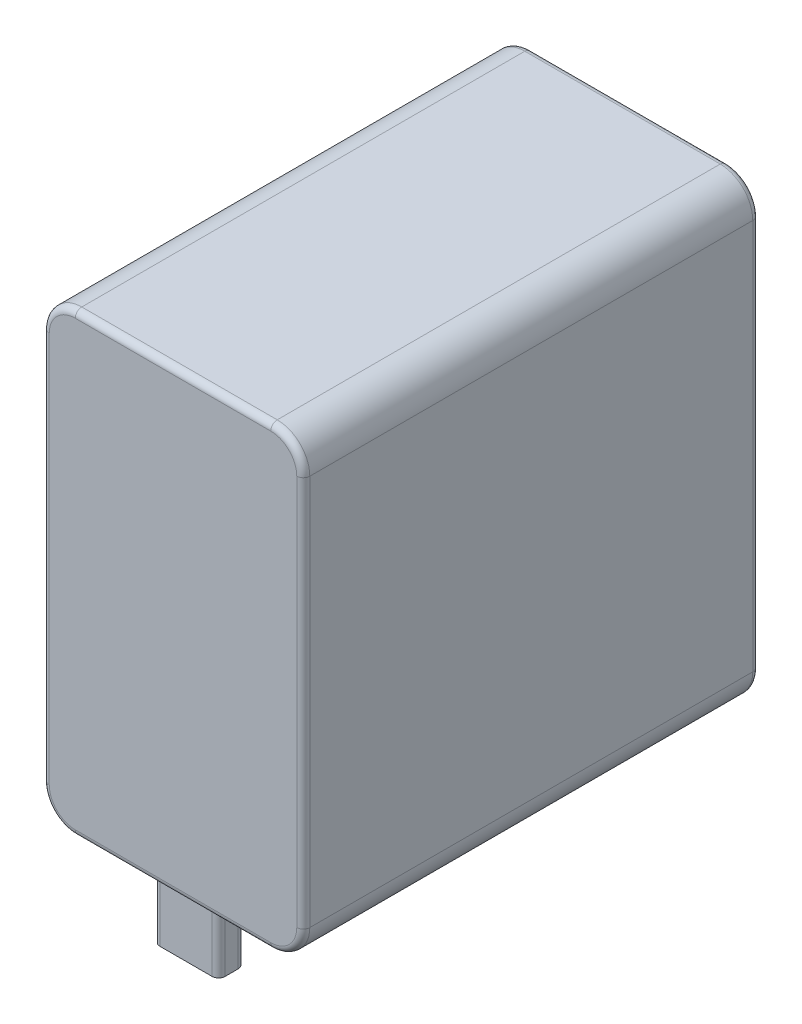
ISO-10303-21;
HEADER;
FILE_DESCRIPTION(('STEP AP214'),'2;1');
FILE_NAME('part.step','',(''),(''),'','','');
FILE_SCHEMA(('AUTOMOTIVE_DESIGN { 1 0 10303 214 1 1 1 1 }'));
ENDSEC;
DATA;
#1=APPLICATION_CONTEXT('core data for automotive mechanical design processes');
#2=APPLICATION_PROTOCOL_DEFINITION('international standard','automotive_design',2000,#1);
#3=PRODUCT_CONTEXT('',#1,'mechanical');
#4=PRODUCT('Part','Part','',(#3));
#5=PRODUCT_RELATED_PRODUCT_CATEGORY('part','',(#4));
#6=PRODUCT_DEFINITION_FORMATION('','',#4);
#7=PRODUCT_DEFINITION_CONTEXT('part definition',#1,'design');
#8=PRODUCT_DEFINITION('design','',#6,#7);
#9=PRODUCT_DEFINITION_SHAPE('','',#8);
#10=(LENGTH_UNIT() NAMED_UNIT(*) SI_UNIT(.MILLI.,.METRE.));
#11=(NAMED_UNIT(*) PLANE_ANGLE_UNIT() SI_UNIT($,.RADIAN.));
#12=(NAMED_UNIT(*) SI_UNIT($,.STERADIAN.) SOLID_ANGLE_UNIT());
#13=UNCERTAINTY_MEASURE_WITH_UNIT(LENGTH_MEASURE(1.E-05),#10,'distance_accuracy_value','');
#14=(GEOMETRIC_REPRESENTATION_CONTEXT(3) GLOBAL_UNCERTAINTY_ASSIGNED_CONTEXT((#13)) GLOBAL_UNIT_ASSIGNED_CONTEXT((#10,
#11,#12)) REPRESENTATION_CONTEXT('',''));
#15=CARTESIAN_POINT('',(0.,0.,0.));
#16=DIRECTION('',(0.,0.,1.));
#17=DIRECTION('',(1.,0.,0.));
#18=AXIS2_PLACEMENT_3D('',#15,#16,#17);
#19=CARTESIAN_POINT('',(24.,-38.,-3.));
#20=DIRECTION('',(0.,1.,0.));
#21=DIRECTION('',(0.,0.,1.));
#22=AXIS2_PLACEMENT_3D('',#19,#20,#21);
#23=CYLINDRICAL_SURFACE('',#22,1.);
#24=CARTESIAN_POINT('',(24.,-38.,-3.));
#25=DIRECTION('',(0.,-1.,0.));
#26=DIRECTION('',(0.,0.,-1.));
#27=AXIS2_PLACEMENT_3D('',#24,#25,#26);
#28=CIRCLE('',#27,1.);
#29=CARTESIAN_POINT('',(25.,-38.,-3.));
#30=VERTEX_POINT('',#29);
#31=CARTESIAN_POINT('',(24.,-38.,-2.));
#32=VERTEX_POINT('',#31);
#33=EDGE_CURVE('E319',#30,#32,#28,.T.);
#34=ORIENTED_EDGE('',*,*,#33,.F.);
#35=DIRECTION('',(0.,-1.,0.));
#36=VECTOR('',#35,1.);
#37=CARTESIAN_POINT('',(25.,-38.,-3.));
#38=LINE('',#37,#36);
#39=CARTESIAN_POINT('',(25.,-28.,-3.));
#40=VERTEX_POINT('',#39);
#41=EDGE_CURVE('E433',#40,#30,#38,.T.);
#42=ORIENTED_EDGE('',*,*,#41,.F.);
#43=CARTESIAN_POINT('',(24.,-28.,-3.));
#44=DIRECTION('',(0.,1.,0.));
#45=DIRECTION('',(0.,0.,1.));
#46=AXIS2_PLACEMENT_3D('',#43,#44,#45);
#47=CIRCLE('',#46,1.);
#48=CARTESIAN_POINT('',(24.,-28.,-2.));
#49=VERTEX_POINT('',#48);
#50=EDGE_CURVE('E311',#49,#40,#47,.T.);
#51=ORIENTED_EDGE('',*,*,#50,.F.);
#52=DIRECTION('',(0.,1.,0.));
#53=VECTOR('',#52,1.);
#54=CARTESIAN_POINT('',(24.,-38.,-2.));
#55=LINE('',#54,#53);
#56=EDGE_CURVE('E421',#32,#49,#55,.T.);
#57=ORIENTED_EDGE('',*,*,#56,.F.);
#58=EDGE_LOOP('',(#34,#42,#51,#57));
#59=FACE_BOUND('',#58,.T.);
#60=ADVANCED_FACE('F61',(#59),#23,.T.);
#61=CARTESIAN_POINT('',(16.,-38.,-3.));
#62=DIRECTION('',(0.,-1.,0.));
#63=DIRECTION('',(0.,0.,-1.));
#64=AXIS2_PLACEMENT_3D('',#61,#62,#63);
#65=CYLINDRICAL_SURFACE('',#64,1.);
#66=CARTESIAN_POINT('',(16.,-38.,-3.));
#67=DIRECTION('',(0.,-1.,0.));
#68=DIRECTION('',(0.,0.,-1.));
#69=AXIS2_PLACEMENT_3D('',#66,#67,#68);
#70=CIRCLE('',#69,1.);
#71=CARTESIAN_POINT('',(16.,-38.,-2.));
#72=VERTEX_POINT('',#71);
#73=CARTESIAN_POINT('',(15.,-38.,-3.));
#74=VERTEX_POINT('',#73);
#75=EDGE_CURVE('E402',#72,#74,#70,.T.);
#76=ORIENTED_EDGE('',*,*,#75,.F.);
#77=DIRECTION('',(0.,-1.,0.));
#78=VECTOR('',#77,1.);
#79=CARTESIAN_POINT('',(16.,-38.,-2.));
#80=LINE('',#79,#78);
#81=CARTESIAN_POINT('',(16.,-28.,-2.));
#82=VERTEX_POINT('',#81);
#83=EDGE_CURVE('E348',#82,#72,#80,.T.);
#84=ORIENTED_EDGE('',*,*,#83,.F.);
#85=CARTESIAN_POINT('',(16.,-28.,-3.));
#86=DIRECTION('',(0.,1.,0.));
#87=DIRECTION('',(0.,0.,1.));
#88=AXIS2_PLACEMENT_3D('',#85,#86,#87);
#89=CIRCLE('',#88,1.);
#90=CARTESIAN_POINT('',(15.,-28.,-3.));
#91=VERTEX_POINT('',#90);
#92=EDGE_CURVE('E312',#91,#82,#89,.T.);
#93=ORIENTED_EDGE('',*,*,#92,.F.);
#94=DIRECTION('',(0.,1.,0.));
#95=VECTOR('',#94,1.);
#96=CARTESIAN_POINT('',(15.,-28.,-3.));
#97=LINE('',#96,#95);
#98=EDGE_CURVE('E366',#74,#91,#97,.T.);
#99=ORIENTED_EDGE('',*,*,#98,.F.);
#100=EDGE_LOOP('',(#76,#84,#93,#99));
#101=FACE_BOUND('',#100,.T.);
#102=ADVANCED_FACE('F589',(#101),#65,.T.);
#103=CARTESIAN_POINT('',(24.,-38.,-5.));
#104=DIRECTION('',(0.,-1.,0.));
#105=DIRECTION('',(0.,0.,-1.));
#106=AXIS2_PLACEMENT_3D('',#103,#104,#105);
#107=CYLINDRICAL_SURFACE('',#106,1.);
#108=CARTESIAN_POINT('',(24.,-38.,-5.));
#109=DIRECTION('',(0.,-1.,0.));
#110=DIRECTION('',(0.,0.,-1.));
#111=AXIS2_PLACEMENT_3D('',#108,#109,#110);
#112=CIRCLE('',#111,1.);
#113=CARTESIAN_POINT('',(24.,-38.,-6.));
#114=VERTEX_POINT('',#113);
#115=CARTESIAN_POINT('',(25.,-38.,-5.));
#116=VERTEX_POINT('',#115);
#117=EDGE_CURVE('E316',#114,#116,#112,.T.);
#118=ORIENTED_EDGE('',*,*,#117,.F.);
#119=DIRECTION('',(0.,-1.,0.));
#120=VECTOR('',#119,1.);
#121=CARTESIAN_POINT('',(24.,-38.,-6.));
#122=LINE('',#121,#120);
#123=CARTESIAN_POINT('',(24.,-28.,-6.));
#124=VERTEX_POINT('',#123);
#125=EDGE_CURVE('E388',#124,#114,#122,.T.);
#126=ORIENTED_EDGE('',*,*,#125,.F.);
#127=CARTESIAN_POINT('',(24.,-28.,-5.));
#128=DIRECTION('',(0.,1.,0.));
#129=DIRECTION('',(0.,0.,1.));
#130=AXIS2_PLACEMENT_3D('',#127,#128,#129);
#131=CIRCLE('',#130,1.);
#132=CARTESIAN_POINT('',(25.,-28.,-5.));
#133=VERTEX_POINT('',#132);
#134=EDGE_CURVE('E331',#133,#124,#131,.T.);
#135=ORIENTED_EDGE('',*,*,#134,.F.);
#136=DIRECTION('',(0.,1.,0.));
#137=VECTOR('',#136,1.);
#138=CARTESIAN_POINT('',(25.,-28.,-5.));
#139=LINE('',#138,#137);
#140=EDGE_CURVE('E387',#116,#133,#139,.T.);
#141=ORIENTED_EDGE('',*,*,#140,.F.);
#142=EDGE_LOOP('',(#118,#126,#135,#141));
#143=FACE_BOUND('',#142,.T.);
#144=ADVANCED_FACE('F575',(#143),#107,.T.);
#145=CARTESIAN_POINT('',(16.,-38.,-5.));
#146=DIRECTION('',(0.,1.,0.));
#147=DIRECTION('',(0.,0.,1.));
#148=AXIS2_PLACEMENT_3D('',#145,#146,#147);
#149=CYLINDRICAL_SURFACE('',#148,1.);
#150=CARTESIAN_POINT('',(16.,-38.,-5.));
#151=DIRECTION('',(0.,-1.,0.));
#152=DIRECTION('',(0.,0.,-1.));
#153=AXIS2_PLACEMENT_3D('',#150,#151,#152);
#154=CIRCLE('',#153,1.);
#155=CARTESIAN_POINT('',(15.,-38.,-5.));
#156=VERTEX_POINT('',#155);
#157=CARTESIAN_POINT('',(16.,-38.,-6.));
#158=VERTEX_POINT('',#157);
#159=EDGE_CURVE('E320',#156,#158,#154,.T.);
#160=ORIENTED_EDGE('',*,*,#159,.F.);
#161=DIRECTION('',(0.,-1.,0.));
#162=VECTOR('',#161,1.);
#163=CARTESIAN_POINT('',(15.,-38.,-5.));
#164=LINE('',#163,#162);
#165=CARTESIAN_POINT('',(15.,-28.,-5.));
#166=VERTEX_POINT('',#165);
#167=EDGE_CURVE('E367',#166,#156,#164,.T.);
#168=ORIENTED_EDGE('',*,*,#167,.F.);
#169=CARTESIAN_POINT('',(16.,-28.,-5.));
#170=DIRECTION('',(0.,1.,0.));
#171=DIRECTION('',(0.,0.,1.));
#172=AXIS2_PLACEMENT_3D('',#169,#170,#171);
#173=CIRCLE('',#172,1.);
#174=CARTESIAN_POINT('',(16.,-28.,-6.));
#175=VERTEX_POINT('',#174);
#176=EDGE_CURVE('E371',#175,#166,#173,.T.);
#177=ORIENTED_EDGE('',*,*,#176,.F.);
#178=DIRECTION('',(0.,1.,0.));
#179=VECTOR('',#178,1.);
#180=CARTESIAN_POINT('',(16.,-38.,-6.));
#181=LINE('',#180,#179);
#182=EDGE_CURVE('E428',#158,#175,#181,.T.);
#183=ORIENTED_EDGE('',*,*,#182,.F.);
#184=EDGE_LOOP('',(#160,#168,#177,#183));
#185=FACE_BOUND('',#184,.T.);
#186=ADVANCED_FACE('F878',(#185),#149,.T.);
#187=CARTESIAN_POINT('',(1.,0.,-1.));
#188=DIRECTION('',(0.,-1.,0.));
#189=DIRECTION('',(0.,0.,-1.));
#190=AXIS2_PLACEMENT_3D('',#187,#188,#189);
#191=CYLINDRICAL_SURFACE('',#190,1.);
#192=DIRECTION('',(0.,-1.,0.));
#193=VECTOR('',#192,1.);
#194=CARTESIAN_POINT('',(1.,-23.,0.));
#195=LINE('',#194,#193);
#196=CARTESIAN_POINT('',(1.,37.,0.));
#197=VERTEX_POINT('',#196);
#198=CARTESIAN_POINT('',(1.,-23.,0.));
#199=VERTEX_POINT('',#198);
#200=EDGE_CURVE('E521',#197,#199,#195,.T.);
#201=ORIENTED_EDGE('',*,*,#200,.F.);
#202=CARTESIAN_POINT('',(1.,37.,-1.));
#203=DIRECTION('',(0.,-1.,0.));
#204=DIRECTION('',(0.,0.,-1.));
#205=AXIS2_PLACEMENT_3D('',#202,#203,#204);
#206=CIRCLE('',#205,1.);
#207=CARTESIAN_POINT('',(0.,37.,-1.));
#208=VERTEX_POINT('',#207);
#209=EDGE_CURVE('E502',#197,#208,#206,.T.);
#210=ORIENTED_EDGE('',*,*,#209,.T.);
#211=DIRECTION('',(0.,1.,0.));
#212=VECTOR('',#211,1.);
#213=CARTESIAN_POINT('',(0.,23.,-1.));
#214=LINE('',#213,#212);
#215=CARTESIAN_POINT('',(0.,-23.,-1.));
#216=VERTEX_POINT('',#215);
#217=EDGE_CURVE('E344',#216,#208,#214,.T.);
#218=ORIENTED_EDGE('',*,*,#217,.F.);
#219=CARTESIAN_POINT('',(1.,-23.,-1.));
#220=DIRECTION('',(0.,1.,0.));
#221=DIRECTION('',(0.,0.,1.));
#222=AXIS2_PLACEMENT_3D('',#219,#220,#221);
#223=CIRCLE('',#222,1.);
#224=EDGE_CURVE('E268',#216,#199,#223,.T.);
#225=ORIENTED_EDGE('',*,*,#224,.T.);
#226=EDGE_LOOP('',(#201,#210,#218,#225));
#227=FACE_BOUND('',#226,.T.);
#228=ADVANCED_FACE('F540',(#227),#191,.T.);
#229=CARTESIAN_POINT('',(5.,-23.,-1.));
#230=DIRECTION('',(0.,0.,1.));
#231=DIRECTION('',(1.,0.,0.));
#232=AXIS2_PLACEMENT_3D('',#229,#230,#231);
#233=TOROIDAL_SURFACE('',#232,4.,1.);
#234=CARTESIAN_POINT('',(5.,-27.,-1.));
#235=DIRECTION('',(-1.,0.,0.));
#236=DIRECTION('',(0.,0.,1.));
#237=AXIS2_PLACEMENT_3D('',#234,#235,#236);
#238=CIRCLE('',#237,1.);
#239=CARTESIAN_POINT('',(5.,-28.,-1.));
#240=VERTEX_POINT('',#239);
#241=CARTESIAN_POINT('',(5.,-27.,0.));
#242=VERTEX_POINT('',#241);
#243=EDGE_CURVE('E256',#240,#242,#238,.T.);
#244=ORIENTED_EDGE('',*,*,#243,.T.);
#245=CARTESIAN_POINT('',(5.,-23.,0.));
#246=DIRECTION('',(0.,0.,1.));
#247=DIRECTION('',(1.,0.,0.));
#248=AXIS2_PLACEMENT_3D('',#245,#246,#247);
#249=CIRCLE('',#248,4.);
#250=EDGE_CURVE('E542',#199,#242,#249,.T.);
#251=ORIENTED_EDGE('',*,*,#250,.F.);
#252=ORIENTED_EDGE('',*,*,#224,.F.);
#253=CARTESIAN_POINT('',(5.,-23.,-1.));
#254=DIRECTION('',(0.,0.,-1.));
#255=DIRECTION('',(1.,0.,0.));
#256=AXIS2_PLACEMENT_3D('',#253,#254,#255);
#257=CIRCLE('',#256,5.);
#258=EDGE_CURVE('E272',#240,#216,#257,.T.);
#259=ORIENTED_EDGE('',*,*,#258,.F.);
#260=EDGE_LOOP('',(#244,#251,#252,#259));
#261=FACE_BOUND('',#260,.T.);
#262=ADVANCED_FACE('F273',(#261),#233,.T.);
#263=CARTESIAN_POINT('',(40.,-27.,-1.));
#264=DIRECTION('',(1.,0.,0.));
#265=DIRECTION('',(0.,0.,-1.));
#266=AXIS2_PLACEMENT_3D('',#263,#264,#265);
#267=CYLINDRICAL_SURFACE('',#266,1.);
#268=CARTESIAN_POINT('',(35.,-27.,-1.));
#269=DIRECTION('',(-1.,0.,0.));
#270=DIRECTION('',(0.,0.,1.));
#271=AXIS2_PLACEMENT_3D('',#268,#269,#270);
#272=CIRCLE('',#271,1.);
#273=CARTESIAN_POINT('',(35.,-28.,-1.));
#274=VERTEX_POINT('',#273);
#275=CARTESIAN_POINT('',(35.,-27.,0.));
#276=VERTEX_POINT('',#275);
#277=EDGE_CURVE('E269',#274,#276,#272,.T.);
#278=ORIENTED_EDGE('',*,*,#277,.T.);
#279=DIRECTION('',(1.,0.,0.));
#280=VECTOR('',#279,1.);
#281=CARTESIAN_POINT('',(35.,-27.,0.));
#282=LINE('',#281,#280);
#283=EDGE_CURVE('E263',#242,#276,#282,.T.);
#284=ORIENTED_EDGE('',*,*,#283,.F.);
#285=ORIENTED_EDGE('',*,*,#243,.F.);
#286=DIRECTION('',(-1.,0.,0.));
#287=VECTOR('',#286,1.);
#288=CARTESIAN_POINT('',(5.,-28.,-1.));
#289=LINE('',#288,#287);
#290=EDGE_CURVE('E260',#274,#240,#289,.T.);
#291=ORIENTED_EDGE('',*,*,#290,.F.);
#292=EDGE_LOOP('',(#278,#284,#285,#291));
#293=FACE_BOUND('',#292,.T.);
#294=ADVANCED_FACE('F258',(#293),#267,.T.);
#295=CARTESIAN_POINT('',(35.,-23.,-1.));
#296=DIRECTION('',(0.,0.,1.));
#297=DIRECTION('',(1.,0.,0.));
#298=AXIS2_PLACEMENT_3D('',#295,#296,#297);
#299=TOROIDAL_SURFACE('',#298,4.,1.);
#300=CARTESIAN_POINT('',(39.,-23.,-1.));
#301=DIRECTION('',(0.,-1.,0.));
#302=DIRECTION('',(0.,0.,-1.));
#303=AXIS2_PLACEMENT_3D('',#300,#301,#302);
#304=CIRCLE('',#303,1.);
#305=CARTESIAN_POINT('',(40.,-23.,-1.));
#306=VERTEX_POINT('',#305);
#307=CARTESIAN_POINT('',(39.,-23.,0.));
#308=VERTEX_POINT('',#307);
#309=EDGE_CURVE('E436',#306,#308,#304,.T.);
#310=ORIENTED_EDGE('',*,*,#309,.T.);
#311=CARTESIAN_POINT('',(35.,-23.,0.));
#312=DIRECTION('',(0.,0.,1.));
#313=DIRECTION('',(1.,0.,0.));
#314=AXIS2_PLACEMENT_3D('',#311,#312,#313);
#315=CIRCLE('',#314,4.);
#316=EDGE_CURVE('E305',#276,#308,#315,.T.);
#317=ORIENTED_EDGE('',*,*,#316,.F.);
#318=ORIENTED_EDGE('',*,*,#277,.F.);
#319=CARTESIAN_POINT('',(35.,-23.,-1.));
#320=DIRECTION('',(0.,0.,-1.));
#321=DIRECTION('',(1.,0.,0.));
#322=AXIS2_PLACEMENT_3D('',#319,#320,#321);
#323=CIRCLE('',#322,5.);
#324=EDGE_CURVE('E401',#306,#274,#323,.T.);
#325=ORIENTED_EDGE('',*,*,#324,.F.);
#326=EDGE_LOOP('',(#310,#317,#318,#325));
#327=FACE_BOUND('',#326,.T.);
#328=ADVANCED_FACE('F846',(#327),#299,.T.);
#329=CARTESIAN_POINT('',(39.,0.,-1.));
#330=DIRECTION('',(0.,1.,0.));
#331=DIRECTION('',(0.,0.,1.));
#332=AXIS2_PLACEMENT_3D('',#329,#330,#331);
#333=CYLINDRICAL_SURFACE('',#332,1.);
#334=DIRECTION('',(0.,-1.,0.));
#335=VECTOR('',#334,1.);
#336=CARTESIAN_POINT('',(40.,0.,-1.));
#337=LINE('',#336,#335);
#338=CARTESIAN_POINT('',(40.,37.,-1.));
#339=VERTEX_POINT('',#338);
#340=EDGE_CURVE('E339',#339,#306,#337,.T.);
#341=ORIENTED_EDGE('',*,*,#340,.F.);
#342=CARTESIAN_POINT('',(39.,37.,-1.));
#343=DIRECTION('',(0.,1.,0.));
#344=DIRECTION('',(0.,0.,1.));
#345=AXIS2_PLACEMENT_3D('',#342,#343,#344);
#346=CIRCLE('',#345,1.);
#347=CARTESIAN_POINT('',(39.,37.,0.));
#348=VERTEX_POINT('',#347);
#349=EDGE_CURVE('E498',#339,#348,#346,.F.);
#350=ORIENTED_EDGE('',*,*,#349,.T.);
#351=DIRECTION('',(0.,1.,0.));
#352=VECTOR('',#351,1.);
#353=CARTESIAN_POINT('',(39.,0.,0.));
#354=LINE('',#353,#352);
#355=EDGE_CURVE('E299',#308,#348,#354,.T.);
#356=ORIENTED_EDGE('',*,*,#355,.F.);
#357=ORIENTED_EDGE('',*,*,#309,.F.);
#358=EDGE_LOOP('',(#341,#350,#356,#357));
#359=FACE_BOUND('',#358,.T.);
#360=ADVANCED_FACE('F837',(#359),#333,.T.);
#361=CARTESIAN_POINT('',(40.,-27.,-69.));
#362=DIRECTION('',(-1.,0.,0.));
#363=DIRECTION('',(0.,0.,1.));
#364=AXIS2_PLACEMENT_3D('',#361,#362,#363);
#365=CYLINDRICAL_SURFACE('',#364,1.);
#366=CARTESIAN_POINT('',(35.,-27.,-69.));
#367=DIRECTION('',(-1.,0.,0.));
#368=DIRECTION('',(0.,0.,1.));
#369=AXIS2_PLACEMENT_3D('',#366,#367,#368);
#370=CIRCLE('',#369,1.);
#371=CARTESIAN_POINT('',(35.,-27.,-70.));
#372=VERTEX_POINT('',#371);
#373=CARTESIAN_POINT('',(35.,-28.,-69.));
#374=VERTEX_POINT('',#373);
#375=EDGE_CURVE('E357',#372,#374,#370,.T.);
#376=ORIENTED_EDGE('',*,*,#375,.T.);
#377=DIRECTION('',(1.,0.,0.));
#378=VECTOR('',#377,1.);
#379=CARTESIAN_POINT('',(40.,-28.,-69.));
#380=LINE('',#379,#378);
#381=CARTESIAN_POINT('',(5.,-28.,-69.));
#382=VERTEX_POINT('',#381);
#383=EDGE_CURVE('E298',#382,#374,#380,.T.);
#384=ORIENTED_EDGE('',*,*,#383,.F.);
#385=CARTESIAN_POINT('',(5.,-27.,-69.));
#386=DIRECTION('',(1.,0.,0.));
#387=DIRECTION('',(0.,0.,-1.));
#388=AXIS2_PLACEMENT_3D('',#385,#386,#387);
#389=CIRCLE('',#388,1.);
#390=CARTESIAN_POINT('',(5.,-27.,-70.));
#391=VERTEX_POINT('',#390);
#392=EDGE_CURVE('E360',#382,#391,#389,.T.);
#393=ORIENTED_EDGE('',*,*,#392,.T.);
#394=DIRECTION('',(-1.,0.,0.));
#395=VECTOR('',#394,1.);
#396=CARTESIAN_POINT('',(40.,-27.,-70.));
#397=LINE('',#396,#395);
#398=EDGE_CURVE('E379',#372,#391,#397,.T.);
#399=ORIENTED_EDGE('',*,*,#398,.F.);
#400=EDGE_LOOP('',(#376,#384,#393,#399));
#401=FACE_BOUND('',#400,.T.);
#402=ADVANCED_FACE('F828',(#401),#365,.T.);
#403=CARTESIAN_POINT('',(5.,-23.,-69.));
#404=DIRECTION('',(0.,0.,1.));
#405=DIRECTION('',(1.,0.,0.));
#406=AXIS2_PLACEMENT_3D('',#403,#404,#405);
#407=TOROIDAL_SURFACE('',#406,4.,1.);
#408=CARTESIAN_POINT('',(1.,-23.,-69.));
#409=DIRECTION('',(0.,-1.,0.));
#410=DIRECTION('',(0.,0.,-1.));
#411=AXIS2_PLACEMENT_3D('',#408,#409,#410);
#412=CIRCLE('',#411,1.);
#413=CARTESIAN_POINT('',(0.,-23.,-69.));
#414=VERTEX_POINT('',#413);
#415=CARTESIAN_POINT('',(1.,-23.,-70.));
#416=VERTEX_POINT('',#415);
#417=EDGE_CURVE('E361',#414,#416,#412,.T.);
#418=ORIENTED_EDGE('',*,*,#417,.T.);
#419=CARTESIAN_POINT('',(5.,-23.,-70.));
#420=DIRECTION('',(0.,0.,-1.));
#421=DIRECTION('',(1.,0.,0.));
#422=AXIS2_PLACEMENT_3D('',#419,#420,#421);
#423=CIRCLE('',#422,4.);
#424=EDGE_CURVE('E326',#391,#416,#423,.T.);
#425=ORIENTED_EDGE('',*,*,#424,.F.);
#426=ORIENTED_EDGE('',*,*,#392,.F.);
#427=CARTESIAN_POINT('',(5.,-23.,-69.));
#428=DIRECTION('',(0.,0.,1.));
#429=DIRECTION('',(1.,0.,0.));
#430=AXIS2_PLACEMENT_3D('',#427,#428,#429);
#431=CIRCLE('',#430,5.);
#432=EDGE_CURVE('E281',#414,#382,#431,.T.);
#433=ORIENTED_EDGE('',*,*,#432,.F.);
#434=EDGE_LOOP('',(#418,#425,#426,#433));
#435=FACE_BOUND('',#434,.T.);
#436=ADVANCED_FACE('F819',(#435),#407,.T.);
#437=CARTESIAN_POINT('',(35.,-23.,-69.));
#438=DIRECTION('',(0.,0.,1.));
#439=DIRECTION('',(1.,0.,0.));
#440=AXIS2_PLACEMENT_3D('',#437,#438,#439);
#441=TOROIDAL_SURFACE('',#440,4.,1.);
#442=CARTESIAN_POINT('',(39.,-23.,-69.));
#443=DIRECTION('',(0.,-1.,0.));
#444=DIRECTION('',(0.,0.,-1.));
#445=AXIS2_PLACEMENT_3D('',#442,#443,#444);
#446=CIRCLE('',#445,1.);
#447=CARTESIAN_POINT('',(39.,-23.,-70.));
#448=VERTEX_POINT('',#447);
#449=CARTESIAN_POINT('',(40.,-23.,-69.));
#450=VERTEX_POINT('',#449);
#451=EDGE_CURVE('E280',#448,#450,#446,.T.);
#452=ORIENTED_EDGE('',*,*,#451,.T.);
#453=CARTESIAN_POINT('',(35.,-23.,-69.));
#454=DIRECTION('',(0.,0.,1.));
#455=DIRECTION('',(1.,0.,0.));
#456=AXIS2_PLACEMENT_3D('',#453,#454,#455);
#457=CIRCLE('',#456,5.);
#458=EDGE_CURVE('E397',#374,#450,#457,.T.);
#459=ORIENTED_EDGE('',*,*,#458,.F.);
#460=ORIENTED_EDGE('',*,*,#375,.F.);
#461=CARTESIAN_POINT('',(35.,-23.,-70.));
#462=DIRECTION('',(0.,0.,-1.));
#463=DIRECTION('',(1.,0.,0.));
#464=AXIS2_PLACEMENT_3D('',#461,#462,#463);
#465=CIRCLE('',#464,4.);
#466=EDGE_CURVE('E375',#448,#372,#465,.T.);
#467=ORIENTED_EDGE('',*,*,#466,.F.);
#468=EDGE_LOOP('',(#452,#459,#460,#467));
#469=FACE_BOUND('',#468,.T.);
#470=ADVANCED_FACE('F809',(#469),#441,.T.);
#471=CARTESIAN_POINT('',(1.,0.,-69.));
#472=DIRECTION('',(0.,1.,0.));
#473=DIRECTION('',(0.,0.,1.));
#474=AXIS2_PLACEMENT_3D('',#471,#472,#473);
#475=CYLINDRICAL_SURFACE('',#474,1.);
#476=DIRECTION('',(0.,-1.,0.));
#477=VECTOR('',#476,1.);
#478=CARTESIAN_POINT('',(0.,0.,-69.));
#479=LINE('',#478,#477);
#480=CARTESIAN_POINT('',(0.,37.,-69.));
#481=VERTEX_POINT('',#480);
#482=EDGE_CURVE('E405',#481,#414,#479,.T.);
#483=ORIENTED_EDGE('',*,*,#482,.F.);
#484=CARTESIAN_POINT('',(1.,37.,-69.));
#485=DIRECTION('',(0.,1.,0.));
#486=DIRECTION('',(0.,0.,1.));
#487=AXIS2_PLACEMENT_3D('',#484,#485,#486);
#488=CIRCLE('',#487,1.);
#489=CARTESIAN_POINT('',(1.,37.,-70.));
#490=VERTEX_POINT('',#489);
#491=EDGE_CURVE('E489',#481,#490,#488,.F.);
#492=ORIENTED_EDGE('',*,*,#491,.T.);
#493=DIRECTION('',(0.,1.,0.));
#494=VECTOR('',#493,1.);
#495=CARTESIAN_POINT('',(1.,0.,-70.));
#496=LINE('',#495,#494);
#497=EDGE_CURVE('E321',#416,#490,#496,.T.);
#498=ORIENTED_EDGE('',*,*,#497,.F.);
#499=ORIENTED_EDGE('',*,*,#417,.F.);
#500=EDGE_LOOP('',(#483,#492,#498,#499));
#501=FACE_BOUND('',#500,.T.);
#502=ADVANCED_FACE('F799',(#501),#475,.T.);
#503=CARTESIAN_POINT('',(39.,0.,-69.));
#504=DIRECTION('',(0.,-1.,0.));
#505=DIRECTION('',(0.,0.,-1.));
#506=AXIS2_PLACEMENT_3D('',#503,#504,#505);
#507=CYLINDRICAL_SURFACE('',#506,1.);
#508=DIRECTION('',(0.,-1.,0.));
#509=VECTOR('',#508,1.);
#510=CARTESIAN_POINT('',(39.,-23.,-70.));
#511=LINE('',#510,#509);
#512=CARTESIAN_POINT('',(39.,37.,-70.));
#513=VERTEX_POINT('',#512);
#514=EDGE_CURVE('E325',#513,#448,#511,.T.);
#515=ORIENTED_EDGE('',*,*,#514,.F.);
#516=CARTESIAN_POINT('',(39.,37.,-69.));
#517=DIRECTION('',(0.,-1.,0.));
#518=DIRECTION('',(0.,0.,-1.));
#519=AXIS2_PLACEMENT_3D('',#516,#517,#518);
#520=CIRCLE('',#519,1.);
#521=CARTESIAN_POINT('',(40.,37.,-69.));
#522=VERTEX_POINT('',#521);
#523=EDGE_CURVE('E470',#513,#522,#520,.T.);
#524=ORIENTED_EDGE('',*,*,#523,.T.);
#525=DIRECTION('',(0.,1.,0.));
#526=VECTOR('',#525,1.);
#527=CARTESIAN_POINT('',(40.,23.,-69.));
#528=LINE('',#527,#526);
#529=EDGE_CURVE('E335',#450,#522,#528,.T.);
#530=ORIENTED_EDGE('',*,*,#529,.F.);
#531=ORIENTED_EDGE('',*,*,#451,.F.);
#532=EDGE_LOOP('',(#515,#524,#530,#531));
#533=FACE_BOUND('',#532,.T.);
#534=ADVANCED_FACE('F791',(#533),#507,.T.);
#535=CARTESIAN_POINT('',(5.,-23.,-35.));
#536=DIRECTION('',(0.,0.,-1.));
#537=DIRECTION('',(0.,1.,0.));
#538=AXIS2_PLACEMENT_3D('',#535,#536,#537);
#539=CYLINDRICAL_SURFACE('',#538,5.);
#540=DIRECTION('',(0.,0.,1.));
#541=VECTOR('',#540,1.);
#542=CARTESIAN_POINT('',(0.,-23.,-35.));
#543=LINE('',#542,#541);
#544=EDGE_CURVE('E349',#414,#216,#543,.T.);
#545=ORIENTED_EDGE('',*,*,#544,.F.);
#546=ORIENTED_EDGE('',*,*,#432,.T.);
#547=DIRECTION('',(0.,0.,-1.));
#548=VECTOR('',#547,1.);
#549=CARTESIAN_POINT('',(5.,-28.,-35.));
#550=LINE('',#549,#548);
#551=EDGE_CURVE('E287',#240,#382,#550,.T.);
#552=ORIENTED_EDGE('',*,*,#551,.F.);
#553=ORIENTED_EDGE('',*,*,#258,.T.);
#554=EDGE_LOOP('',(#545,#546,#552,#553));
#555=FACE_BOUND('',#554,.T.);
#556=ADVANCED_FACE('F294',(#555),#539,.T.);
#557=CARTESIAN_POINT('',(35.,-23.,-35.));
#558=DIRECTION('',(0.,0.,1.));
#559=DIRECTION('',(0.,-1.,0.));
#560=AXIS2_PLACEMENT_3D('',#557,#558,#559);
#561=CYLINDRICAL_SURFACE('',#560,5.);
#562=DIRECTION('',(0.,0.,1.));
#563=VECTOR('',#562,1.);
#564=CARTESIAN_POINT('',(35.,-28.,0.));
#565=LINE('',#564,#563);
#566=EDGE_CURVE('E289',#374,#274,#565,.T.);
#567=ORIENTED_EDGE('',*,*,#566,.F.);
#568=ORIENTED_EDGE('',*,*,#458,.T.);
#569=DIRECTION('',(0.,0.,-1.));
#570=VECTOR('',#569,1.);
#571=CARTESIAN_POINT('',(40.,-23.,-70.));
#572=LINE('',#571,#570);
#573=EDGE_CURVE('E340',#306,#450,#572,.T.);
#574=ORIENTED_EDGE('',*,*,#573,.F.);
#575=ORIENTED_EDGE('',*,*,#324,.T.);
#576=EDGE_LOOP('',(#567,#568,#574,#575));
#577=FACE_BOUND('',#576,.T.);
#578=ADVANCED_FACE('F774',(#577),#561,.T.);
#579=CARTESIAN_POINT('',(20.,-38.,-35.));
#580=DIRECTION('',(0.,-1.,0.));
#581=DIRECTION('',(0.,0.,-1.));
#582=AXIS2_PLACEMENT_3D('',#579,#580,#581);
#583=PLANE('',#582);
#584=DIRECTION('',(0.,0.,-1.));
#585=VECTOR('',#584,1.);
#586=CARTESIAN_POINT('',(15.,-38.,-4.));
#587=LINE('',#586,#585);
#588=EDGE_CURVE('E362',#74,#156,#587,.T.);
#589=ORIENTED_EDGE('',*,*,#588,.T.);
#590=ORIENTED_EDGE('',*,*,#159,.T.);
#591=DIRECTION('',(1.,0.,0.));
#592=VECTOR('',#591,1.);
#593=CARTESIAN_POINT('',(20.,-38.,-6.));
#594=LINE('',#593,#592);
#595=EDGE_CURVE('E427',#158,#114,#594,.T.);
#596=ORIENTED_EDGE('',*,*,#595,.T.);
#597=ORIENTED_EDGE('',*,*,#117,.T.);
#598=DIRECTION('',(0.,0.,-1.));
#599=VECTOR('',#598,1.);
#600=CARTESIAN_POINT('',(25.,-38.,-4.));
#601=LINE('',#600,#599);
#602=EDGE_CURVE('E383',#30,#116,#601,.T.);
#603=ORIENTED_EDGE('',*,*,#602,.F.);
#604=ORIENTED_EDGE('',*,*,#33,.T.);
#605=DIRECTION('',(1.,0.,0.));
#606=VECTOR('',#605,1.);
#607=CARTESIAN_POINT('',(20.,-38.,-2.));
#608=LINE('',#607,#606);
#609=EDGE_CURVE('E417',#72,#32,#608,.T.);
#610=ORIENTED_EDGE('',*,*,#609,.F.);
#611=ORIENTED_EDGE('',*,*,#75,.T.);
#612=EDGE_LOOP('',(#589,#590,#596,#597,#603,#604,#610,#611));
#613=FACE_BOUND('',#612,.T.);
#614=ADVANCED_FACE('F565',(#613),#583,.T.);
#615=CARTESIAN_POINT('',(25.,-38.,-4.));
#616=DIRECTION('',(1.,0.,0.));
#617=DIRECTION('',(0.,1.,0.));
#618=AXIS2_PLACEMENT_3D('',#615,#616,#617);
#619=PLANE('',#618);
#620=ORIENTED_EDGE('',*,*,#602,.T.);
#621=ORIENTED_EDGE('',*,*,#140,.T.);
#622=DIRECTION('',(0.,0.,-1.));
#623=VECTOR('',#622,1.);
#624=CARTESIAN_POINT('',(25.,-28.,-4.));
#625=LINE('',#624,#623);
#626=EDGE_CURVE('E327',#40,#133,#625,.T.);
#627=ORIENTED_EDGE('',*,*,#626,.F.);
#628=ORIENTED_EDGE('',*,*,#41,.T.);
#629=EDGE_LOOP('',(#620,#621,#627,#628));
#630=FACE_BOUND('',#629,.T.);
#631=ADVANCED_FACE('F578',(#630),#619,.T.);
#632=CARTESIAN_POINT('',(20.,-38.,-6.));
#633=DIRECTION('',(0.,0.,1.));
#634=DIRECTION('',(0.,-1.,0.));
#635=AXIS2_PLACEMENT_3D('',#632,#633,#634);
#636=PLANE('',#635);
#637=ORIENTED_EDGE('',*,*,#595,.F.);
#638=ORIENTED_EDGE('',*,*,#182,.T.);
#639=DIRECTION('',(1.,0.,0.));
#640=VECTOR('',#639,1.);
#641=CARTESIAN_POINT('',(20.,-28.,-6.));
#642=LINE('',#641,#640);
#643=EDGE_CURVE('E356',#175,#124,#642,.T.);
#644=ORIENTED_EDGE('',*,*,#643,.T.);
#645=ORIENTED_EDGE('',*,*,#125,.T.);
#646=EDGE_LOOP('',(#637,#638,#644,#645));
#647=FACE_BOUND('',#646,.T.);
#648=ADVANCED_FACE('F570',(#647),#636,.F.);
#649=CARTESIAN_POINT('',(15.,-38.,-4.));
#650=DIRECTION('',(1.,0.,0.));
#651=DIRECTION('',(0.,1.,0.));
#652=AXIS2_PLACEMENT_3D('',#649,#650,#651);
#653=PLANE('',#652);
#654=DIRECTION('',(0.,0.,-1.));
#655=VECTOR('',#654,1.);
#656=CARTESIAN_POINT('',(15.,-28.,-4.));
#657=LINE('',#656,#655);
#658=EDGE_CURVE('E291',#91,#166,#657,.T.);
#659=ORIENTED_EDGE('',*,*,#658,.T.);
#660=ORIENTED_EDGE('',*,*,#167,.T.);
#661=ORIENTED_EDGE('',*,*,#588,.F.);
#662=ORIENTED_EDGE('',*,*,#98,.T.);
#663=EDGE_LOOP('',(#659,#660,#661,#662));
#664=FACE_BOUND('',#663,.T.);
#665=ADVANCED_FACE('F699',(#664),#653,.F.);
#666=CARTESIAN_POINT('',(20.,-38.,-2.));
#667=DIRECTION('',(0.,0.,1.));
#668=DIRECTION('',(0.,-1.,0.));
#669=AXIS2_PLACEMENT_3D('',#666,#667,#668);
#670=PLANE('',#669);
#671=DIRECTION('',(1.,0.,0.));
#672=VECTOR('',#671,1.);
#673=CARTESIAN_POINT('',(20.,-28.,-2.));
#674=LINE('',#673,#672);
#675=EDGE_CURVE('E308',#82,#49,#674,.T.);
#676=ORIENTED_EDGE('',*,*,#675,.F.);
#677=ORIENTED_EDGE('',*,*,#83,.T.);
#678=ORIENTED_EDGE('',*,*,#609,.T.);
#679=ORIENTED_EDGE('',*,*,#56,.T.);
#680=EDGE_LOOP('',(#676,#677,#678,#679));
#681=FACE_BOUND('',#680,.T.);
#682=ADVANCED_FACE('F586',(#681),#670,.T.);
#683=CARTESIAN_POINT('',(0.,0.,-35.));
#684=DIRECTION('',(1.,0.,0.));
#685=DIRECTION('',(0.,1.,0.));
#686=AXIS2_PLACEMENT_3D('',#683,#684,#685);
#687=PLANE('',#686);
#688=ORIENTED_EDGE('',*,*,#217,.T.);
#689=DIRECTION('',(0.,0.,-1.));
#690=VECTOR('',#689,1.);
#691=CARTESIAN_POINT('',(0.,37.,-69.));
#692=LINE('',#691,#690);
#693=EDGE_CURVE('E454',#208,#481,#692,.T.);
#694=ORIENTED_EDGE('',*,*,#693,.T.);
#695=ORIENTED_EDGE('',*,*,#482,.T.);
#696=ORIENTED_EDGE('',*,*,#544,.T.);
#697=EDGE_LOOP('',(#688,#694,#695,#696));
#698=FACE_BOUND('',#697,.T.);
#699=ADVANCED_FACE('F718',(#698),#687,.F.);
#700=CARTESIAN_POINT('',(40.,0.,-35.));
#701=DIRECTION('',(1.,0.,0.));
#702=DIRECTION('',(0.,1.,0.));
#703=AXIS2_PLACEMENT_3D('',#700,#701,#702);
#704=PLANE('',#703);
#705=ORIENTED_EDGE('',*,*,#529,.T.);
#706=DIRECTION('',(0.,0.,1.));
#707=VECTOR('',#706,1.);
#708=CARTESIAN_POINT('',(40.,37.,-35.));
#709=LINE('',#708,#707);
#710=EDGE_CURVE('E466',#522,#339,#709,.T.);
#711=ORIENTED_EDGE('',*,*,#710,.T.);
#712=ORIENTED_EDGE('',*,*,#340,.T.);
#713=ORIENTED_EDGE('',*,*,#573,.T.);
#714=EDGE_LOOP('',(#705,#711,#712,#713));
#715=FACE_BOUND('',#714,.T.);
#716=ADVANCED_FACE('F722',(#715),#704,.T.);
#717=CARTESIAN_POINT('',(40.,0.,-70.));
#718=DIRECTION('',(0.,0.,1.));
#719=DIRECTION('',(1.,0.,0.));
#720=AXIS2_PLACEMENT_3D('',#717,#718,#719);
#721=PLANE('',#720);
#722=DIRECTION('',(-1.,0.,0.));
#723=VECTOR('',#722,1.);
#724=CARTESIAN_POINT('',(35.,41.,-70.));
#725=LINE('',#724,#723);
#726=CARTESIAN_POINT('',(5.,41.,-70.));
#727=VERTEX_POINT('',#726);
#728=CARTESIAN_POINT('',(35.,41.,-70.));
#729=VERTEX_POINT('',#728);
#730=EDGE_CURVE('E474',#727,#729,#725,.F.);
#731=ORIENTED_EDGE('',*,*,#730,.T.);
#732=CARTESIAN_POINT('',(35.,37.,-70.));
#733=DIRECTION('',(0.,0.,1.));
#734=DIRECTION('',(1.,0.,0.));
#735=AXIS2_PLACEMENT_3D('',#732,#733,#734);
#736=CIRCLE('',#735,4.);
#737=EDGE_CURVE('E480',#729,#513,#736,.F.);
#738=ORIENTED_EDGE('',*,*,#737,.T.);
#739=ORIENTED_EDGE('',*,*,#514,.T.);
#740=ORIENTED_EDGE('',*,*,#466,.T.);
#741=ORIENTED_EDGE('',*,*,#398,.T.);
#742=ORIENTED_EDGE('',*,*,#424,.T.);
#743=ORIENTED_EDGE('',*,*,#497,.T.);
#744=CARTESIAN_POINT('',(5.,37.,-70.));
#745=DIRECTION('',(0.,0.,1.));
#746=DIRECTION('',(1.,0.,0.));
#747=AXIS2_PLACEMENT_3D('',#744,#745,#746);
#748=CIRCLE('',#747,4.);
#749=EDGE_CURVE('E477',#490,#727,#748,.F.);
#750=ORIENTED_EDGE('',*,*,#749,.T.);
#751=EDGE_LOOP('',(#731,#738,#739,#740,#741,#742,#743,#750));
#752=FACE_BOUND('',#751,.T.);
#753=ADVANCED_FACE('F712',(#752),#721,.F.);
#754=CARTESIAN_POINT('',(40.,-28.,-35.));
#755=DIRECTION('',(0.,1.,0.));
#756=DIRECTION('',(0.,0.,-1.));
#757=AXIS2_PLACEMENT_3D('',#754,#755,#756);
#758=PLANE('',#757);
#759=ORIENTED_EDGE('',*,*,#658,.F.);
#760=ORIENTED_EDGE('',*,*,#92,.T.);
#761=ORIENTED_EDGE('',*,*,#675,.T.);
#762=ORIENTED_EDGE('',*,*,#50,.T.);
#763=ORIENTED_EDGE('',*,*,#626,.T.);
#764=ORIENTED_EDGE('',*,*,#134,.T.);
#765=ORIENTED_EDGE('',*,*,#643,.F.);
#766=ORIENTED_EDGE('',*,*,#176,.T.);
#767=EDGE_LOOP('',(#759,#760,#761,#762,#763,#764,#765,#766));
#768=FACE_BOUND('',#767,.T.);
#769=ORIENTED_EDGE('',*,*,#551,.T.);
#770=ORIENTED_EDGE('',*,*,#383,.T.);
#771=ORIENTED_EDGE('',*,*,#566,.T.);
#772=ORIENTED_EDGE('',*,*,#290,.T.);
#773=EDGE_LOOP('',(#769,#770,#771,#772));
#774=FACE_BOUND('',#773,.T.);
#775=ADVANCED_FACE('F285',(#768,#774),#758,.F.);
#776=CARTESIAN_POINT('',(40.,0.,0.));
#777=DIRECTION('',(0.,0.,1.));
#778=DIRECTION('',(1.,0.,0.));
#779=AXIS2_PLACEMENT_3D('',#776,#777,#778);
#780=PLANE('',#779);
#781=DIRECTION('',(1.,0.,0.));
#782=VECTOR('',#781,1.);
#783=CARTESIAN_POINT('',(40.,41.,0.));
#784=LINE('',#783,#782);
#785=CARTESIAN_POINT('',(35.,41.,0.));
#786=VERTEX_POINT('',#785);
#787=CARTESIAN_POINT('',(5.,41.,0.));
#788=VERTEX_POINT('',#787);
#789=EDGE_CURVE('E79',#786,#788,#784,.F.);
#790=ORIENTED_EDGE('',*,*,#789,.T.);
#791=CARTESIAN_POINT('',(5.,37.,0.));
#792=DIRECTION('',(0.,0.,1.));
#793=DIRECTION('',(1.,0.,0.));
#794=AXIS2_PLACEMENT_3D('',#791,#792,#793);
#795=CIRCLE('',#794,4.);
#796=EDGE_CURVE('E509',#788,#197,#795,.T.);
#797=ORIENTED_EDGE('',*,*,#796,.T.);
#798=ORIENTED_EDGE('',*,*,#200,.T.);
#799=ORIENTED_EDGE('',*,*,#250,.T.);
#800=ORIENTED_EDGE('',*,*,#283,.T.);
#801=ORIENTED_EDGE('',*,*,#316,.T.);
#802=ORIENTED_EDGE('',*,*,#355,.T.);
#803=CARTESIAN_POINT('',(35.,37.,0.));
#804=DIRECTION('',(0.,0.,1.));
#805=DIRECTION('',(1.,0.,0.));
#806=AXIS2_PLACEMENT_3D('',#803,#804,#805);
#807=CIRCLE('',#806,4.);
#808=EDGE_CURVE('E84',#348,#786,#807,.T.);
#809=ORIENTED_EDGE('',*,*,#808,.T.);
#810=EDGE_LOOP('',(#790,#797,#798,#799,#800,#801,#802,#809));
#811=FACE_BOUND('',#810,.T.);
#812=ADVANCED_FACE('F538',(#811),#780,.T.);
#813=CARTESIAN_POINT('',(0.,42.,0.));
#814=DIRECTION('',(0.,1.,0.));
#815=DIRECTION('',(0.,0.,1.));
#816=AXIS2_PLACEMENT_3D('',#813,#814,#815);
#817=PLANE('',#816);
#818=DIRECTION('',(0.,0.,-1.));
#819=VECTOR('',#818,1.);
#820=CARTESIAN_POINT('',(5.,42.,-1.));
#821=LINE('',#820,#819);
#822=CARTESIAN_POINT('',(5.,42.,-69.));
#823=VERTEX_POINT('',#822);
#824=CARTESIAN_POINT('',(5.,42.,-1.));
#825=VERTEX_POINT('',#824);
#826=EDGE_CURVE('E462',#823,#825,#821,.F.);
#827=ORIENTED_EDGE('',*,*,#826,.T.);
#828=DIRECTION('',(1.,0.,0.));
#829=VECTOR('',#828,1.);
#830=CARTESIAN_POINT('',(0.,42.,-1.));
#831=LINE('',#830,#829);
#832=CARTESIAN_POINT('',(35.,42.,-1.));
#833=VERTEX_POINT('',#832);
#834=EDGE_CURVE('E11',#825,#833,#831,.T.);
#835=ORIENTED_EDGE('',*,*,#834,.T.);
#836=DIRECTION('',(0.,0.,1.));
#837=VECTOR('',#836,1.);
#838=CARTESIAN_POINT('',(35.,42.,0.));
#839=LINE('',#838,#837);
#840=CARTESIAN_POINT('',(35.,42.,-69.));
#841=VERTEX_POINT('',#840);
#842=EDGE_CURVE('E458',#833,#841,#839,.F.);
#843=ORIENTED_EDGE('',*,*,#842,.T.);
#844=DIRECTION('',(-1.,0.,0.));
#845=VECTOR('',#844,1.);
#846=CARTESIAN_POINT('',(5.,42.,-69.));
#847=LINE('',#846,#845);
#848=EDGE_CURVE('E71',#841,#823,#847,.T.);
#849=ORIENTED_EDGE('',*,*,#848,.T.);
#850=EDGE_LOOP('',(#827,#835,#843,#849));
#851=FACE_BOUND('',#850,.T.);
#852=ADVANCED_FACE('F693',(#851),#817,.T.);
#853=CARTESIAN_POINT('',(5.,37.,-35.));
#854=DIRECTION('',(0.,0.,1.));
#855=DIRECTION('',(0.,-1.,0.));
#856=AXIS2_PLACEMENT_3D('',#853,#854,#855);
#857=CYLINDRICAL_SURFACE('',#856,5.);
#858=ORIENTED_EDGE('',*,*,#826,.F.);
#859=CARTESIAN_POINT('',(5.,37.,-69.));
#860=DIRECTION('',(0.,0.,1.));
#861=DIRECTION('',(1.,0.,0.));
#862=AXIS2_PLACEMENT_3D('',#859,#860,#861);
#863=CIRCLE('',#862,5.);
#864=EDGE_CURVE('E495',#823,#481,#863,.T.);
#865=ORIENTED_EDGE('',*,*,#864,.T.);
#866=ORIENTED_EDGE('',*,*,#693,.F.);
#867=CARTESIAN_POINT('',(5.,37.,-1.));
#868=DIRECTION('',(0.,0.,1.));
#869=DIRECTION('',(1.,0.,0.));
#870=AXIS2_PLACEMENT_3D('',#867,#868,#869);
#871=CIRCLE('',#870,5.);
#872=EDGE_CURVE('E492',#208,#825,#871,.F.);
#873=ORIENTED_EDGE('',*,*,#872,.T.);
#874=EDGE_LOOP('',(#858,#865,#866,#873));
#875=FACE_BOUND('',#874,.T.);
#876=ADVANCED_FACE('F977',(#875),#857,.T.);
#877=CARTESIAN_POINT('',(35.,37.,-35.));
#878=DIRECTION('',(0.,0.,1.));
#879=DIRECTION('',(0.,-1.,0.));
#880=AXIS2_PLACEMENT_3D('',#877,#878,#879);
#881=CYLINDRICAL_SURFACE('',#880,5.);
#882=ORIENTED_EDGE('',*,*,#710,.F.);
#883=CARTESIAN_POINT('',(35.,37.,-69.));
#884=DIRECTION('',(0.,0.,1.));
#885=DIRECTION('',(1.,0.,0.));
#886=AXIS2_PLACEMENT_3D('',#883,#884,#885);
#887=CIRCLE('',#886,5.);
#888=EDGE_CURVE('E486',#522,#841,#887,.T.);
#889=ORIENTED_EDGE('',*,*,#888,.T.);
#890=ORIENTED_EDGE('',*,*,#842,.F.);
#891=CARTESIAN_POINT('',(35.,37.,-1.));
#892=DIRECTION('',(0.,0.,1.));
#893=DIRECTION('',(1.,0.,0.));
#894=AXIS2_PLACEMENT_3D('',#891,#892,#893);
#895=CIRCLE('',#894,5.);
#896=EDGE_CURVE('E483',#833,#339,#895,.F.);
#897=ORIENTED_EDGE('',*,*,#896,.T.);
#898=EDGE_LOOP('',(#882,#889,#890,#897));
#899=FACE_BOUND('',#898,.T.);
#900=ADVANCED_FACE('F987',(#899),#881,.T.);
#901=CARTESIAN_POINT('',(5.,37.,-69.));
#902=DIRECTION('',(0.,0.,1.));
#903=DIRECTION('',(1.,0.,0.));
#904=AXIS2_PLACEMENT_3D('',#901,#902,#903);
#905=TOROIDAL_SURFACE('',#904,4.,1.);
#906=ORIENTED_EDGE('',*,*,#491,.F.);
#907=ORIENTED_EDGE('',*,*,#864,.F.);
#908=CARTESIAN_POINT('',(5.,41.,-69.));
#909=DIRECTION('',(1.,0.,0.));
#910=DIRECTION('',(0.,0.,-1.));
#911=AXIS2_PLACEMENT_3D('',#908,#909,#910);
#912=CIRCLE('',#911,1.);
#913=EDGE_CURVE('E518',#727,#823,#912,.T.);
#914=ORIENTED_EDGE('',*,*,#913,.F.);
#915=ORIENTED_EDGE('',*,*,#749,.F.);
#916=EDGE_LOOP('',(#906,#907,#914,#915));
#917=FACE_BOUND('',#916,.T.);
#918=ADVANCED_FACE('F997',(#917),#905,.T.);
#919=CARTESIAN_POINT('',(0.,41.,-69.));
#920=DIRECTION('',(1.,0.,0.));
#921=DIRECTION('',(0.,0.,-1.));
#922=AXIS2_PLACEMENT_3D('',#919,#920,#921);
#923=CYLINDRICAL_SURFACE('',#922,1.);
#924=ORIENTED_EDGE('',*,*,#913,.T.);
#925=ORIENTED_EDGE('',*,*,#848,.F.);
#926=CARTESIAN_POINT('',(35.,41.,-69.));
#927=DIRECTION('',(1.,0.,0.));
#928=DIRECTION('',(0.,0.,-1.));
#929=AXIS2_PLACEMENT_3D('',#926,#927,#928);
#930=CIRCLE('',#929,1.);
#931=EDGE_CURVE('E514',#729,#841,#930,.T.);
#932=ORIENTED_EDGE('',*,*,#931,.F.);
#933=ORIENTED_EDGE('',*,*,#730,.F.);
#934=EDGE_LOOP('',(#924,#925,#932,#933));
#935=FACE_BOUND('',#934,.T.);
#936=ADVANCED_FACE('F1007',(#935),#923,.T.);
#937=CARTESIAN_POINT('',(35.,37.,-69.));
#938=DIRECTION('',(0.,0.,1.));
#939=DIRECTION('',(1.,0.,0.));
#940=AXIS2_PLACEMENT_3D('',#937,#938,#939);
#941=TOROIDAL_SURFACE('',#940,4.,1.);
#942=ORIENTED_EDGE('',*,*,#523,.F.);
#943=ORIENTED_EDGE('',*,*,#737,.F.);
#944=ORIENTED_EDGE('',*,*,#931,.T.);
#945=ORIENTED_EDGE('',*,*,#888,.F.);
#946=EDGE_LOOP('',(#942,#943,#944,#945));
#947=FACE_BOUND('',#946,.T.);
#948=ADVANCED_FACE('F1018',(#947),#941,.T.);
#949=CARTESIAN_POINT('',(5.,37.,-1.));
#950=DIRECTION('',(0.,0.,1.));
#951=DIRECTION('',(1.,0.,0.));
#952=AXIS2_PLACEMENT_3D('',#949,#950,#951);
#953=TOROIDAL_SURFACE('',#952,4.,1.);
#954=ORIENTED_EDGE('',*,*,#209,.F.);
#955=ORIENTED_EDGE('',*,*,#796,.F.);
#956=CARTESIAN_POINT('',(5.,41.,-1.));
#957=DIRECTION('',(1.,0.,0.));
#958=DIRECTION('',(0.,0.,-1.));
#959=AXIS2_PLACEMENT_3D('',#956,#957,#958);
#960=CIRCLE('',#959,1.);
#961=EDGE_CURVE('E65',#825,#788,#960,.T.);
#962=ORIENTED_EDGE('',*,*,#961,.F.);
#963=ORIENTED_EDGE('',*,*,#872,.F.);
#964=EDGE_LOOP('',(#954,#955,#962,#963));
#965=FACE_BOUND('',#964,.T.);
#966=ADVANCED_FACE('F63',(#965),#953,.T.);
#967=CARTESIAN_POINT('',(0.,41.,-1.));
#968=DIRECTION('',(1.,0.,0.));
#969=DIRECTION('',(0.,0.,-1.));
#970=AXIS2_PLACEMENT_3D('',#967,#968,#969);
#971=CYLINDRICAL_SURFACE('',#970,1.);
#972=ORIENTED_EDGE('',*,*,#961,.T.);
#973=ORIENTED_EDGE('',*,*,#789,.F.);
#974=CARTESIAN_POINT('',(35.,41.,-1.));
#975=DIRECTION('',(1.,0.,0.));
#976=DIRECTION('',(0.,0.,-1.));
#977=AXIS2_PLACEMENT_3D('',#974,#975,#976);
#978=CIRCLE('',#977,1.);
#979=EDGE_CURVE('E522',#833,#786,#978,.T.);
#980=ORIENTED_EDGE('',*,*,#979,.F.);
#981=ORIENTED_EDGE('',*,*,#834,.F.);
#982=EDGE_LOOP('',(#972,#973,#980,#981));
#983=FACE_BOUND('',#982,.T.);
#984=ADVANCED_FACE('F533',(#983),#971,.T.);
#985=CARTESIAN_POINT('',(35.,37.,-1.));
#986=DIRECTION('',(0.,0.,1.));
#987=DIRECTION('',(1.,0.,0.));
#988=AXIS2_PLACEMENT_3D('',#985,#986,#987);
#989=TOROIDAL_SURFACE('',#988,4.,1.);
#990=ORIENTED_EDGE('',*,*,#979,.T.);
#991=ORIENTED_EDGE('',*,*,#808,.F.);
#992=ORIENTED_EDGE('',*,*,#349,.F.);
#993=ORIENTED_EDGE('',*,*,#896,.F.);
#994=EDGE_LOOP('',(#990,#991,#992,#993));
#995=FACE_BOUND('',#994,.T.);
#996=ADVANCED_FACE('F1046',(#995),#989,.T.);
#997=CLOSED_SHELL('',(#60,#102,#144,#186,#228,#262,#294,#328,#360,#402,#436,#470,#502,#534,#556,
#578,#614,#631,#648,#665,#682,#699,#716,#753,#775,#812,#852,#876,#900,#918,#936,#948,#966,#984,#996));
#998=MANIFOLD_SOLID_BREP('B2',#997);
#999=ADVANCED_BREP_SHAPE_REPRESENTATION('',(#18,#998),#14);
#1000=SHAPE_DEFINITION_REPRESENTATION(#9,#999);
ENDSEC;
END-ISO-10303-21;
